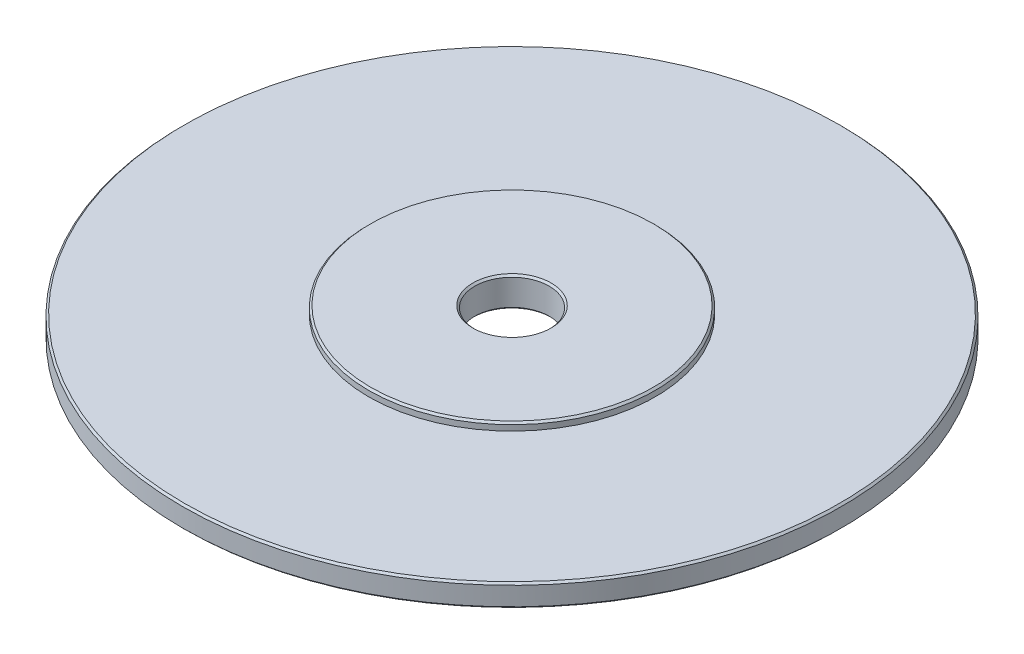
ISO-10303-21;
HEADER;
FILE_DESCRIPTION(('STEP AP214'),'2;1');
FILE_NAME('part.step','',(''),(''),'','','');
FILE_SCHEMA(('AUTOMOTIVE_DESIGN { 1 0 10303 214 1 1 1 1 }'));
ENDSEC;
DATA;
#1=APPLICATION_CONTEXT('core data for automotive mechanical design processes');
#2=APPLICATION_PROTOCOL_DEFINITION('international standard','automotive_design',2000,#1);
#3=PRODUCT_CONTEXT('',#1,'mechanical');
#4=PRODUCT('Part','Part','',(#3));
#5=PRODUCT_RELATED_PRODUCT_CATEGORY('part','',(#4));
#6=PRODUCT_DEFINITION_FORMATION('','',#4);
#7=PRODUCT_DEFINITION_CONTEXT('part definition',#1,'design');
#8=PRODUCT_DEFINITION('design','',#6,#7);
#9=PRODUCT_DEFINITION_SHAPE('','',#8);
#10=(LENGTH_UNIT() NAMED_UNIT(*) SI_UNIT(.MILLI.,.METRE.));
#11=(NAMED_UNIT(*) PLANE_ANGLE_UNIT() SI_UNIT($,.RADIAN.));
#12=(NAMED_UNIT(*) SI_UNIT($,.STERADIAN.) SOLID_ANGLE_UNIT());
#13=UNCERTAINTY_MEASURE_WITH_UNIT(LENGTH_MEASURE(1.E-05),#10,'distance_accuracy_value','');
#14=(GEOMETRIC_REPRESENTATION_CONTEXT(3) GLOBAL_UNCERTAINTY_ASSIGNED_CONTEXT((#13)) GLOBAL_UNIT_ASSIGNED_CONTEXT((#10,
#11,#12)) REPRESENTATION_CONTEXT('',''));
#15=CARTESIAN_POINT('',(0.,0.,0.));
#16=DIRECTION('',(0.,0.,1.));
#17=DIRECTION('',(1.,0.,0.));
#18=AXIS2_PLACEMENT_3D('',#15,#16,#17);
#19=CARTESIAN_POINT('',(0.,0.,0.));
#20=DIRECTION('',(0.,-1.,0.));
#21=DIRECTION('',(0.,0.,-1.));
#22=AXIS2_PLACEMENT_3D('',#19,#20,#21);
#23=CYLINDRICAL_SURFACE('',#22,88.5);
#24=CARTESIAN_POINT('',(0.,0.500000000000028,0.));
#25=DIRECTION('',(0.,-1.,0.));
#26=DIRECTION('',(0.,0.,-1.));
#27=AXIS2_PLACEMENT_3D('',#24,#25,#26);
#28=CIRCLE('',#27,88.5);
#29=CARTESIAN_POINT('',(0.,0.500000000000028,-88.5));
#30=VERTEX_POINT('',#29);
#31=EDGE_CURVE('E57',#30,#30,#28,.F.);
#32=ORIENTED_EDGE('',*,*,#31,.T.);
#33=EDGE_LOOP('',(#32));
#34=FACE_BOUND('',#33,.T.);
#35=CARTESIAN_POINT('',(0.,5.49999999999994,0.));
#36=DIRECTION('',(0.,1.,0.));
#37=DIRECTION('',(0.,0.,1.));
#38=AXIS2_PLACEMENT_3D('',#35,#36,#37);
#39=CIRCLE('',#38,88.5);
#40=CARTESIAN_POINT('',(0.,5.49999999999994,88.5));
#41=VERTEX_POINT('',#40);
#42=EDGE_CURVE('E60',#41,#41,#39,.F.);
#43=ORIENTED_EDGE('',*,*,#42,.T.);
#44=EDGE_LOOP('',(#43));
#45=FACE_BOUND('',#44,.T.);
#46=ADVANCED_FACE('F31',(#34,#45),#23,.T.);
#47=CARTESIAN_POINT('',(0.,5.99999999999999,-88.5));
#48=DIRECTION('',(0.,1.,0.));
#49=DIRECTION('',(0.,0.,1.));
#50=AXIS2_PLACEMENT_3D('',#47,#48,#49);
#51=PLANE('',#50);
#52=CARTESIAN_POINT('',(0.,5.99999999999999,0.));
#53=DIRECTION('',(0.,1.,0.));
#54=DIRECTION('',(0.,0.,1.));
#55=AXIS2_PLACEMENT_3D('',#52,#53,#54);
#56=CIRCLE('',#55,87.9999999999999);
#57=CARTESIAN_POINT('',(0.,5.99999999999999,87.9999999999999));
#58=VERTEX_POINT('',#57);
#59=EDGE_CURVE('E54',#58,#58,#56,.T.);
#60=ORIENTED_EDGE('',*,*,#59,.T.);
#61=EDGE_LOOP('',(#60));
#62=FACE_BOUND('',#61,.T.);
#63=CARTESIAN_POINT('',(0.,6.,0.));
#64=DIRECTION('',(0.,-1.,0.));
#65=DIRECTION('',(0.,0.,-1.));
#66=AXIS2_PLACEMENT_3D('',#63,#64,#65);
#67=CIRCLE('',#66,38.5);
#68=CARTESIAN_POINT('',(0.,6.,-38.5));
#69=VERTEX_POINT('',#68);
#70=EDGE_CURVE('E69',#69,#69,#67,.T.);
#71=ORIENTED_EDGE('',*,*,#70,.T.);
#72=EDGE_LOOP('',(#71));
#73=FACE_BOUND('',#72,.T.);
#74=ADVANCED_FACE('F73',(#62,#73),#51,.T.);
#75=CARTESIAN_POINT('',(0.,0.,0.));
#76=DIRECTION('',(0.,-1.,0.));
#77=DIRECTION('',(0.,0.,-1.));
#78=AXIS2_PLACEMENT_3D('',#75,#76,#77);
#79=CYLINDRICAL_SURFACE('',#78,38.5);
#80=CARTESIAN_POINT('',(0.,7.49999999999995,0.));
#81=DIRECTION('',(0.,1.,0.));
#82=DIRECTION('',(0.,0.,1.));
#83=AXIS2_PLACEMENT_3D('',#80,#81,#82);
#84=CIRCLE('',#83,38.5);
#85=CARTESIAN_POINT('',(0.,7.49999999999995,38.5));
#86=VERTEX_POINT('',#85);
#87=EDGE_CURVE('E10',#86,#86,#84,.F.);
#88=ORIENTED_EDGE('',*,*,#87,.T.);
#89=EDGE_LOOP('',(#88));
#90=FACE_BOUND('',#89,.T.);
#91=ORIENTED_EDGE('',*,*,#70,.F.);
#92=EDGE_LOOP('',(#91));
#93=FACE_BOUND('',#92,.T.);
#94=ADVANCED_FACE('F75',(#90,#93),#79,.T.);
#95=CARTESIAN_POINT('',(0.,7.99999999999999,-38.5));
#96=DIRECTION('',(0.,1.,0.));
#97=DIRECTION('',(0.,0.,1.));
#98=AXIS2_PLACEMENT_3D('',#95,#96,#97);
#99=PLANE('',#98);
#100=CARTESIAN_POINT('',(0.,7.99999999999999,0.));
#101=DIRECTION('',(0.,1.,0.));
#102=DIRECTION('',(0.,0.,1.));
#103=AXIS2_PLACEMENT_3D('',#100,#101,#102);
#104=CIRCLE('',#103,10.5);
#105=CARTESIAN_POINT('',(0.,7.99999999999999,10.5));
#106=VERTEX_POINT('',#105);
#107=EDGE_CURVE('E46',#106,#106,#104,.F.);
#108=ORIENTED_EDGE('',*,*,#107,.T.);
#109=EDGE_LOOP('',(#108));
#110=FACE_BOUND('',#109,.T.);
#111=CARTESIAN_POINT('',(0.,7.99999999999999,0.));
#112=DIRECTION('',(0.,1.,0.));
#113=DIRECTION('',(0.,0.,1.));
#114=AXIS2_PLACEMENT_3D('',#111,#112,#113);
#115=CIRCLE('',#114,38.);
#116=CARTESIAN_POINT('',(0.,7.99999999999999,38.));
#117=VERTEX_POINT('',#116);
#118=EDGE_CURVE('E51',#117,#117,#115,.T.);
#119=ORIENTED_EDGE('',*,*,#118,.T.);
#120=EDGE_LOOP('',(#119));
#121=FACE_BOUND('',#120,.T.);
#122=ADVANCED_FACE('F77',(#110,#121),#99,.T.);
#123=CARTESIAN_POINT('',(0.,0.,0.));
#124=DIRECTION('',(0.,-1.,0.));
#125=DIRECTION('',(0.,0.,-1.));
#126=AXIS2_PLACEMENT_3D('',#123,#124,#125);
#127=CYLINDRICAL_SURFACE('',#126,10.);
#128=CARTESIAN_POINT('',(0.,7.50000000000002,0.));
#129=DIRECTION('',(0.,1.,0.));
#130=DIRECTION('',(0.,0.,1.));
#131=AXIS2_PLACEMENT_3D('',#128,#129,#130);
#132=CIRCLE('',#131,10.);
#133=CARTESIAN_POINT('',(0.,7.50000000000002,10.));
#134=VERTEX_POINT('',#133);
#135=EDGE_CURVE('E38',#134,#134,#132,.T.);
#136=ORIENTED_EDGE('',*,*,#135,.T.);
#137=EDGE_LOOP('',(#136));
#138=FACE_BOUND('',#137,.T.);
#139=CARTESIAN_POINT('',(0.,0.49999999999999,0.));
#140=DIRECTION('',(0.,-1.,0.));
#141=DIRECTION('',(0.,0.,-1.));
#142=AXIS2_PLACEMENT_3D('',#139,#140,#141);
#143=CIRCLE('',#142,10.);
#144=CARTESIAN_POINT('',(0.,0.49999999999999,-10.));
#145=VERTEX_POINT('',#144);
#146=EDGE_CURVE('E42',#145,#145,#143,.T.);
#147=ORIENTED_EDGE('',*,*,#146,.T.);
#148=EDGE_LOOP('',(#147));
#149=FACE_BOUND('',#148,.T.);
#150=ADVANCED_FACE('F83',(#138,#149),#127,.F.);
#151=CARTESIAN_POINT('',(0.,0.,-10.));
#152=DIRECTION('',(0.,-1.,0.));
#153=DIRECTION('',(0.,0.,-1.));
#154=AXIS2_PLACEMENT_3D('',#151,#152,#153);
#155=PLANE('',#154);
#156=CARTESIAN_POINT('',(0.,0.,0.));
#157=DIRECTION('',(0.,-1.,0.));
#158=DIRECTION('',(0.,0.,-1.));
#159=AXIS2_PLACEMENT_3D('',#156,#157,#158);
#160=CIRCLE('',#159,87.9999999999999);
#161=CARTESIAN_POINT('',(0.,0.,-87.9999999999999));
#162=VERTEX_POINT('',#161);
#163=EDGE_CURVE('E63',#162,#162,#160,.T.);
#164=ORIENTED_EDGE('',*,*,#163,.T.);
#165=EDGE_LOOP('',(#164));
#166=FACE_BOUND('',#165,.T.);
#167=CARTESIAN_POINT('',(0.,0.,0.));
#168=DIRECTION('',(0.,-1.,0.));
#169=DIRECTION('',(0.,0.,-1.));
#170=AXIS2_PLACEMENT_3D('',#167,#168,#169);
#171=CIRCLE('',#170,10.5);
#172=CARTESIAN_POINT('',(0.,0.,-10.5));
#173=VERTEX_POINT('',#172);
#174=EDGE_CURVE('E66',#173,#173,#171,.F.);
#175=ORIENTED_EDGE('',*,*,#174,.T.);
#176=EDGE_LOOP('',(#175));
#177=FACE_BOUND('',#176,.T.);
#178=ADVANCED_FACE('F99',(#166,#177),#155,.T.);
#179=CARTESIAN_POINT('',(0.,0.,0.));
#180=DIRECTION('',(0.,1.,0.));
#181=DIRECTION('',(0.,0.,1.));
#182=AXIS2_PLACEMENT_3D('',#179,#180,#181);
#183=CONICAL_SURFACE('',#182,87.9999999999999,0.78539816339749);
#184=ORIENTED_EDGE('',*,*,#31,.F.);
#185=EDGE_LOOP('',(#184));
#186=FACE_BOUND('',#185,.T.);
#187=ORIENTED_EDGE('',*,*,#163,.F.);
#188=EDGE_LOOP('',(#187));
#189=FACE_BOUND('',#188,.T.);
#190=ADVANCED_FACE('F95',(#186,#189),#183,.T.);
#191=CARTESIAN_POINT('',(0.,5.49999999999994,0.));
#192=DIRECTION('',(0.,-1.,0.));
#193=DIRECTION('',(0.,0.,-1.));
#194=AXIS2_PLACEMENT_3D('',#191,#192,#193);
#195=CONICAL_SURFACE('',#194,88.5,0.785398163397462);
#196=ORIENTED_EDGE('',*,*,#59,.F.);
#197=EDGE_LOOP('',(#196));
#198=FACE_BOUND('',#197,.T.);
#199=ORIENTED_EDGE('',*,*,#42,.F.);
#200=EDGE_LOOP('',(#199));
#201=FACE_BOUND('',#200,.T.);
#202=ADVANCED_FACE('F98',(#198,#201),#195,.T.);
#203=CARTESIAN_POINT('',(0.,7.99999999999999,0.));
#204=DIRECTION('',(0.,1.,0.));
#205=DIRECTION('',(0.,0.,1.));
#206=AXIS2_PLACEMENT_3D('',#203,#204,#205);
#207=CONICAL_SURFACE('',#206,10.5,0.785398163397455);
#208=ORIENTED_EDGE('',*,*,#135,.F.);
#209=EDGE_LOOP('',(#208));
#210=FACE_BOUND('',#209,.T.);
#211=ORIENTED_EDGE('',*,*,#107,.F.);
#212=EDGE_LOOP('',(#211));
#213=FACE_BOUND('',#212,.T.);
#214=ADVANCED_FACE('F103',(#210,#213),#207,.F.);
#215=CARTESIAN_POINT('',(0.,0.49999999999999,0.));
#216=DIRECTION('',(0.,-1.,0.));
#217=DIRECTION('',(0.,0.,-1.));
#218=AXIS2_PLACEMENT_3D('',#215,#216,#217);
#219=CONICAL_SURFACE('',#218,10.,0.785398163397469);
#220=ORIENTED_EDGE('',*,*,#174,.F.);
#221=EDGE_LOOP('',(#220));
#222=FACE_BOUND('',#221,.T.);
#223=ORIENTED_EDGE('',*,*,#146,.F.);
#224=EDGE_LOOP('',(#223));
#225=FACE_BOUND('',#224,.T.);
#226=ADVANCED_FACE('F106',(#222,#225),#219,.F.);
#227=CARTESIAN_POINT('',(0.,7.49999999999995,0.));
#228=DIRECTION('',(0.,-1.,0.));
#229=DIRECTION('',(0.,0.,-1.));
#230=AXIS2_PLACEMENT_3D('',#227,#228,#229);
#231=CONICAL_SURFACE('',#230,38.5,0.785398163397448);
#232=ORIENTED_EDGE('',*,*,#118,.F.);
#233=EDGE_LOOP('',(#232));
#234=FACE_BOUND('',#233,.T.);
#235=ORIENTED_EDGE('',*,*,#87,.F.);
#236=EDGE_LOOP('',(#235));
#237=FACE_BOUND('',#236,.T.);
#238=ADVANCED_FACE('F33',(#234,#237),#231,.T.);
#239=CLOSED_SHELL('',(#46,#74,#94,#122,#150,#178,#190,#202,#214,#226,#238));
#240=MANIFOLD_SOLID_BREP('B2',#239);
#241=ADVANCED_BREP_SHAPE_REPRESENTATION('',(#18,#240),#14);
#242=SHAPE_DEFINITION_REPRESENTATION(#9,#241);
ENDSEC;
END-ISO-10303-21;
